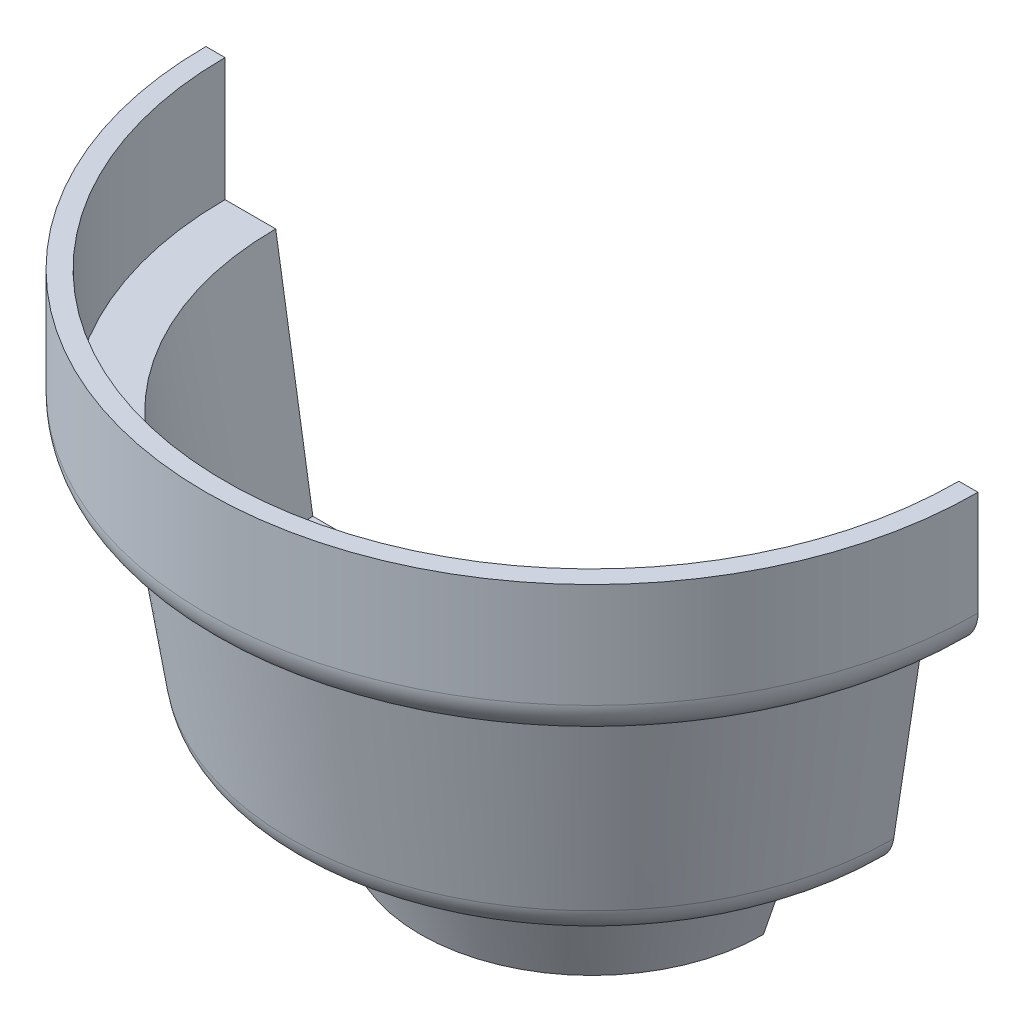
ISO-10303-21;
HEADER;
FILE_DESCRIPTION(('STEP AP214'),'2;1');
FILE_NAME('part.step','',(''),(''),'','','');
FILE_SCHEMA(('AUTOMOTIVE_DESIGN { 1 0 10303 214 1 1 1 1 }'));
ENDSEC;
DATA;
#1=APPLICATION_CONTEXT('core data for automotive mechanical design processes');
#2=APPLICATION_PROTOCOL_DEFINITION('international standard','automotive_design',2000,#1);
#3=PRODUCT_CONTEXT('',#1,'mechanical');
#4=PRODUCT('Part','Part','',(#3));
#5=PRODUCT_RELATED_PRODUCT_CATEGORY('part','',(#4));
#6=PRODUCT_DEFINITION_FORMATION('','',#4);
#7=PRODUCT_DEFINITION_CONTEXT('part definition',#1,'design');
#8=PRODUCT_DEFINITION('design','',#6,#7);
#9=PRODUCT_DEFINITION_SHAPE('','',#8);
#10=(LENGTH_UNIT() NAMED_UNIT(*) SI_UNIT(.MILLI.,.METRE.));
#11=(NAMED_UNIT(*) PLANE_ANGLE_UNIT() SI_UNIT($,.RADIAN.));
#12=(NAMED_UNIT(*) SI_UNIT($,.STERADIAN.) SOLID_ANGLE_UNIT());
#13=UNCERTAINTY_MEASURE_WITH_UNIT(LENGTH_MEASURE(1.E-05),#10,'distance_accuracy_value','');
#14=(GEOMETRIC_REPRESENTATION_CONTEXT(3) GLOBAL_UNCERTAINTY_ASSIGNED_CONTEXT((#13)) GLOBAL_UNIT_ASSIGNED_CONTEXT((#10,
#11,#12)) REPRESENTATION_CONTEXT('',''));
#15=CARTESIAN_POINT('',(0.,0.,0.));
#16=DIRECTION('',(0.,0.,1.));
#17=DIRECTION('',(1.,0.,0.));
#18=AXIS2_PLACEMENT_3D('',#15,#16,#17);
#19=CARTESIAN_POINT('',(321.047285868813,38.0058495677419,0.));
#20=DIRECTION('',(0.,-1.,0.));
#21=DIRECTION('',(0.,0.,-1.));
#22=AXIS2_PLACEMENT_3D('',#19,#20,#21);
#23=CYLINDRICAL_SURFACE('',#22,22.0628773907383);
#24=DIRECTION('',(0.,-1.,0.));
#25=VECTOR('',#24,1.);
#26=CARTESIAN_POINT('',(298.984408478074,66.0235079736991,0.));
#27=LINE('',#26,#25);
#28=CARTESIAN_POINT('',(298.984408478074,66.0235079736991,0.));
#29=VERTEX_POINT('',#28);
#30=CARTESIAN_POINT('',(298.984408478074,60.041083960857,0.));
#31=VERTEX_POINT('',#30);
#32=EDGE_CURVE('E169',#29,#31,#27,.T.);
#33=ORIENTED_EDGE('',*,*,#32,.T.);
#34=CARTESIAN_POINT('',(321.047285868813,60.041083960857,0.));
#35=DIRECTION('',(0.,1.,0.));
#36=DIRECTION('',(0.,0.,1.));
#37=AXIS2_PLACEMENT_3D('',#34,#35,#36);
#38=CIRCLE('',#37,22.0628773907383);
#39=CARTESIAN_POINT('',(343.110163259551,60.041083960857,-1.54064249381893E-13));
#40=VERTEX_POINT('',#39);
#41=EDGE_CURVE('E313',#31,#40,#38,.T.);
#42=ORIENTED_EDGE('',*,*,#41,.T.);
#43=DIRECTION('',(0.,-1.,0.));
#44=VECTOR('',#43,1.);
#45=CARTESIAN_POINT('',(343.110163259551,66.0235079736991,-1.54064249381893E-13));
#46=LINE('',#45,#44);
#47=CARTESIAN_POINT('',(343.110163259551,66.0235079736991,-1.54064249381893E-13));
#48=VERTEX_POINT('',#47);
#49=EDGE_CURVE('E223',#48,#40,#46,.T.);
#50=ORIENTED_EDGE('',*,*,#49,.F.);
#51=CARTESIAN_POINT('',(321.047285868813,66.0235079736991,0.));
#52=DIRECTION('',(0.,-1.,0.));
#53=DIRECTION('',(0.,0.,-1.));
#54=AXIS2_PLACEMENT_3D('',#51,#52,#53);
#55=CIRCLE('',#54,22.0628773907383);
#56=EDGE_CURVE('E274',#48,#29,#55,.T.);
#57=ORIENTED_EDGE('',*,*,#56,.T.);
#58=EDGE_LOOP('',(#33,#42,#50,#57));
#59=FACE_BOUND('',#58,.T.);
#60=ADVANCED_FACE('F45',(#59),#23,.T.);
#61=CARTESIAN_POINT('',(343.110163259551,58.041083960857,-1.54064249381893E-13));
#62=DIRECTION('',(0.,1.,0.));
#63=DIRECTION('',(0.,0.,1.));
#64=AXIS2_PLACEMENT_3D('',#61,#62,#63);
#65=PLANE('',#64);
#66=DIRECTION('',(-1.,0.,0.));
#67=VECTOR('',#66,1.);
#68=CARTESIAN_POINT('',(343.110163259551,58.041083960857,-1.54064249381893E-13));
#69=LINE('',#68,#67);
#70=CARTESIAN_POINT('',(341.110163259551,58.041083960857,-1.40098324026521E-13));
#71=VERTEX_POINT('',#70);
#72=CARTESIAN_POINT('',(340.075256902789,58.041083960857,-1.32871611562355E-13));
#73=VERTEX_POINT('',#72);
#74=EDGE_CURVE('E227',#71,#73,#69,.T.);
#75=ORIENTED_EDGE('',*,*,#74,.F.);
#76=CARTESIAN_POINT('',(321.047285868813,58.041083960857,0.));
#77=DIRECTION('',(0.,1.,0.));
#78=DIRECTION('',(0.,0.,1.));
#79=AXIS2_PLACEMENT_3D('',#76,#77,#78);
#80=CIRCLE('',#79,20.0628773907383);
#81=CARTESIAN_POINT('',(300.984408478074,58.041083960857,0.));
#82=VERTEX_POINT('',#81);
#83=EDGE_CURVE('E166',#71,#82,#80,.F.);
#84=ORIENTED_EDGE('',*,*,#83,.T.);
#85=DIRECTION('',(1.,0.,0.));
#86=VECTOR('',#85,1.);
#87=CARTESIAN_POINT('',(298.984408478074,58.041083960857,0.));
#88=LINE('',#87,#86);
#89=CARTESIAN_POINT('',(302.019314834836,58.041083960857,0.));
#90=VERTEX_POINT('',#89);
#91=EDGE_CURVE('E160',#82,#90,#88,.T.);
#92=ORIENTED_EDGE('',*,*,#91,.T.);
#93=CARTESIAN_POINT('',(321.047285868813,58.041083960857,0.));
#94=DIRECTION('',(0.,-1.,0.));
#95=DIRECTION('',(0.,0.,-1.));
#96=AXIS2_PLACEMENT_3D('',#93,#94,#95);
#97=CIRCLE('',#96,19.0279710339767);
#98=EDGE_CURVE('E164',#73,#90,#97,.T.);
#99=ORIENTED_EDGE('',*,*,#98,.F.);
#100=EDGE_LOOP('',(#75,#84,#92,#99));
#101=FACE_BOUND('',#100,.T.);
#102=ADVANCED_FACE('F163',(#101),#65,.F.);
#103=CARTESIAN_POINT('',(321.047285868813,58.041083960857,0.));
#104=DIRECTION('',(0.,1.,0.));
#105=DIRECTION('',(0.,0.,1.));
#106=AXIS2_PLACEMENT_3D('',#103,#104,#105);
#107=CONICAL_SURFACE('',#106,19.0279710339767,0.152761264242572);
#108=DIRECTION('',(0.15216781752453,-0.988354670808926,0.));
#109=VECTOR('',#108,1.);
#110=CARTESIAN_POINT('',(302.019314834836,58.041083960857,0.));
#111=LINE('',#110,#109);
#112=CARTESIAN_POINT('',(303.800598539088,46.4713572093391,0.));
#113=VERTEX_POINT('',#112);
#114=EDGE_CURVE('E168',#90,#113,#111,.T.);
#115=ORIENTED_EDGE('',*,*,#114,.T.);
#116=CARTESIAN_POINT('',(321.047285868813,46.4713572093391,0.));
#117=DIRECTION('',(0.,-1.,0.));
#118=DIRECTION('',(0.,0.,-1.));
#119=AXIS2_PLACEMENT_3D('',#116,#117,#118);
#120=CIRCLE('',#119,17.2466873297244);
#121=CARTESIAN_POINT('',(338.293973198537,46.4713572093391,-1.2043297393719E-13));
#122=VERTEX_POINT('',#121);
#123=EDGE_CURVE('E54',#113,#122,#120,.F.);
#124=ORIENTED_EDGE('',*,*,#123,.T.);
#125=DIRECTION('',(-0.15216781752453,-0.988354670808926,0.));
#126=VECTOR('',#125,1.);
#127=CARTESIAN_POINT('',(340.075256902789,58.041083960857,-1.32871611562355E-13));
#128=LINE('',#127,#126);
#129=EDGE_CURVE('E172',#73,#122,#128,.T.);
#130=ORIENTED_EDGE('',*,*,#129,.F.);
#131=ORIENTED_EDGE('',*,*,#98,.T.);
#132=EDGE_LOOP('',(#115,#124,#130,#131));
#133=FACE_BOUND('',#132,.T.);
#134=ADVANCED_FACE('F171',(#133),#107,.T.);
#135=CARTESIAN_POINT('',(338.03290745636,44.7756928443881,-1.18609961603147E-13));
#136=DIRECTION('',(0.,1.,0.));
#137=DIRECTION('',(0.,0.,1.));
#138=AXIS2_PLACEMENT_3D('',#135,#136,#137);
#139=PLANE('',#138);
#140=DIRECTION('',(-1.,0.,0.));
#141=VECTOR('',#140,1.);
#142=CARTESIAN_POINT('',(338.03290745636,44.7756928443881,-1.18609961603147E-13));
#143=LINE('',#142,#141);
#144=CARTESIAN_POINT('',(336.317263856919,44.7756928443881,-1.06629686380039E-13));
#145=VERTEX_POINT('',#144);
#146=CARTESIAN_POINT('',(333.161922659749,44.7756928443881,0.));
#147=VERTEX_POINT('',#146);
#148=EDGE_CURVE('E232',#145,#147,#143,.T.);
#149=ORIENTED_EDGE('',*,*,#148,.F.);
#150=CARTESIAN_POINT('',(321.047285868813,44.7756928443881,0.));
#151=DIRECTION('',(0.,1.,0.));
#152=DIRECTION('',(0.,0.,1.));
#153=AXIS2_PLACEMENT_3D('',#150,#151,#152);
#154=CIRCLE('',#153,15.2699779881065);
#155=CARTESIAN_POINT('',(305.777307880706,44.7756928443881,0.));
#156=VERTEX_POINT('',#155);
#157=EDGE_CURVE('E319',#145,#156,#154,.F.);
#158=ORIENTED_EDGE('',*,*,#157,.T.);
#159=DIRECTION('',(1.,0.,0.));
#160=VECTOR('',#159,1.);
#161=CARTESIAN_POINT('',(304.061664281265,44.7756928443881,0.));
#162=LINE('',#161,#160);
#163=CARTESIAN_POINT('',(308.932649077876,44.7756928443881,0.));
#164=VERTEX_POINT('',#163);
#165=EDGE_CURVE('E178',#156,#164,#162,.T.);
#166=ORIENTED_EDGE('',*,*,#165,.T.);
#167=CARTESIAN_POINT('',(321.047285868813,44.7756928443881,0.));
#168=DIRECTION('',(0.,-1.,0.));
#169=DIRECTION('',(0.,0.,-1.));
#170=AXIS2_PLACEMENT_3D('',#167,#168,#169);
#171=CIRCLE('',#170,12.1146367909363);
#172=EDGE_CURVE('E174',#147,#164,#171,.T.);
#173=ORIENTED_EDGE('',*,*,#172,.F.);
#174=EDGE_LOOP('',(#149,#158,#166,#173));
#175=FACE_BOUND('',#174,.T.);
#176=ADVANCED_FACE('F328',(#175),#139,.F.);
#177=CARTESIAN_POINT('',(321.047285868813,44.7756928443881,0.));
#178=DIRECTION('',(0.,1.,0.));
#179=DIRECTION('',(0.,0.,1.));
#180=AXIS2_PLACEMENT_3D('',#177,#178,#179);
#181=CONICAL_SURFACE('',#180,12.1146367909363,0.329049694840344);
#182=CARTESIAN_POINT('',(321.047285868813,38.0058495677419,0.));
#183=DIRECTION('',(0.,-1.,0.));
#184=DIRECTION('',(0.,0.,-1.));
#185=AXIS2_PLACEMENT_3D('',#182,#183,#184);
#186=CIRCLE('',#185,9.80298298915461);
#187=CARTESIAN_POINT('',(330.850268857967,38.0058495677419,0.));
#188=VERTEX_POINT('',#187);
#189=CARTESIAN_POINT('',(311.244302879658,38.0058495677419,0.));
#190=VERTEX_POINT('',#189);
#191=EDGE_CURVE('E302',#188,#190,#186,.T.);
#192=ORIENTED_EDGE('',*,*,#191,.F.);
#193=DIRECTION('',(-0.323143853291515,-0.946349856067993,0.));
#194=VECTOR('',#193,1.);
#195=CARTESIAN_POINT('',(333.161922659749,44.7756928443881,0.));
#196=LINE('',#195,#194);
#197=EDGE_CURVE('E235',#147,#188,#196,.T.);
#198=ORIENTED_EDGE('',*,*,#197,.F.);
#199=ORIENTED_EDGE('',*,*,#172,.T.);
#200=DIRECTION('',(0.323143853291515,-0.946349856067993,0.));
#201=VECTOR('',#200,1.);
#202=CARTESIAN_POINT('',(308.932649077876,44.7756928443881,0.));
#203=LINE('',#202,#201);
#204=EDGE_CURVE('E181',#164,#190,#203,.T.);
#205=ORIENTED_EDGE('',*,*,#204,.T.);
#206=EDGE_LOOP('',(#192,#198,#199,#205));
#207=FACE_BOUND('',#206,.T.);
#208=ADVANCED_FACE('F336',(#207),#181,.T.);
#209=CARTESIAN_POINT('',(330.850268857967,38.0058495677419,0.));
#210=DIRECTION('',(0.,1.,0.));
#211=DIRECTION('',(0.,0.,1.));
#212=AXIS2_PLACEMENT_3D('',#209,#210,#211);
#213=PLANE('',#212);
#214=CARTESIAN_POINT('',(321.047285868813,38.0058495677419,0.));
#215=DIRECTION('',(0.,-1.,0.));
#216=DIRECTION('',(0.,0.,-1.));
#217=AXIS2_PLACEMENT_3D('',#214,#215,#216);
#218=CIRCLE('',#217,7.06097523429028);
#219=CARTESIAN_POINT('',(328.108261103103,38.0058495677419,0.));
#220=VERTEX_POINT('',#219);
#221=CARTESIAN_POINT('',(313.986310634522,38.0058495677419,0.));
#222=VERTEX_POINT('',#221);
#223=EDGE_CURVE('E299',#220,#222,#218,.T.);
#224=ORIENTED_EDGE('',*,*,#223,.F.);
#225=DIRECTION('',(-1.,0.,0.));
#226=VECTOR('',#225,1.);
#227=CARTESIAN_POINT('',(330.850268857967,38.0058495677419,0.));
#228=LINE('',#227,#226);
#229=EDGE_CURVE('E239',#188,#220,#228,.T.);
#230=ORIENTED_EDGE('',*,*,#229,.F.);
#231=ORIENTED_EDGE('',*,*,#191,.T.);
#232=DIRECTION('',(1.,0.,0.));
#233=VECTOR('',#232,1.);
#234=CARTESIAN_POINT('',(311.244302879658,38.0058495677419,0.));
#235=LINE('',#234,#233);
#236=EDGE_CURVE('E188',#190,#222,#235,.T.);
#237=ORIENTED_EDGE('',*,*,#236,.T.);
#238=EDGE_LOOP('',(#224,#230,#231,#237));
#239=FACE_BOUND('',#238,.T.);
#240=ADVANCED_FACE('F343',(#239),#213,.F.);
#241=CARTESIAN_POINT('',(321.047285868813,38.0058495677419,0.));
#242=DIRECTION('',(0.,-1.,0.));
#243=DIRECTION('',(0.,0.,-1.));
#244=AXIS2_PLACEMENT_3D('',#241,#242,#243);
#245=CYLINDRICAL_SURFACE('',#244,7.06097523429028);
#246=CARTESIAN_POINT('',(321.047285868813,38.9746322381523,0.));
#247=DIRECTION('',(0.,-1.,0.));
#248=DIRECTION('',(0.,0.,-1.));
#249=AXIS2_PLACEMENT_3D('',#246,#247,#248);
#250=CIRCLE('',#249,7.06097523429028);
#251=CARTESIAN_POINT('',(328.108261103103,38.9746322381523,0.));
#252=VERTEX_POINT('',#251);
#253=CARTESIAN_POINT('',(313.986310634522,38.9746322381523,0.));
#254=VERTEX_POINT('',#253);
#255=EDGE_CURVE('E296',#252,#254,#250,.T.);
#256=ORIENTED_EDGE('',*,*,#255,.F.);
#257=DIRECTION('',(0.,1.,0.));
#258=VECTOR('',#257,1.);
#259=CARTESIAN_POINT('',(328.108261103103,38.9746322381523,0.));
#260=LINE('',#259,#258);
#261=EDGE_CURVE('E243',#220,#252,#260,.T.);
#262=ORIENTED_EDGE('',*,*,#261,.F.);
#263=ORIENTED_EDGE('',*,*,#223,.T.);
#264=DIRECTION('',(0.,1.,0.));
#265=VECTOR('',#264,1.);
#266=CARTESIAN_POINT('',(313.986310634522,38.9746322381523,0.));
#267=LINE('',#266,#265);
#268=EDGE_CURVE('E192',#222,#254,#267,.T.);
#269=ORIENTED_EDGE('',*,*,#268,.T.);
#270=EDGE_LOOP('',(#256,#262,#263,#269));
#271=FACE_BOUND('',#270,.T.);
#272=ADVANCED_FACE('F345',(#271),#245,.F.);
#273=CARTESIAN_POINT('',(330.085804472857,38.9746322381523,0.));
#274=DIRECTION('',(0.,-1.,0.));
#275=DIRECTION('',(0.,0.,-1.));
#276=AXIS2_PLACEMENT_3D('',#273,#274,#275);
#277=PLANE('',#276);
#278=CARTESIAN_POINT('',(321.047285868813,38.9746322381523,0.));
#279=DIRECTION('',(0.,-1.,0.));
#280=DIRECTION('',(0.,0.,-1.));
#281=AXIS2_PLACEMENT_3D('',#278,#279,#280);
#282=CIRCLE('',#281,9.03851860404403);
#283=CARTESIAN_POINT('',(330.085804472857,38.9746322381523,0.));
#284=VERTEX_POINT('',#283);
#285=CARTESIAN_POINT('',(312.008767264769,38.9746322381523,0.));
#286=VERTEX_POINT('',#285);
#287=EDGE_CURVE('E293',#284,#286,#282,.T.);
#288=ORIENTED_EDGE('',*,*,#287,.F.);
#289=DIRECTION('',(1.,0.,0.));
#290=VECTOR('',#289,1.);
#291=CARTESIAN_POINT('',(330.085804472857,38.9746322381523,0.));
#292=LINE('',#291,#290);
#293=EDGE_CURVE('E247',#252,#284,#292,.T.);
#294=ORIENTED_EDGE('',*,*,#293,.F.);
#295=ORIENTED_EDGE('',*,*,#255,.T.);
#296=DIRECTION('',(-1.,0.,0.));
#297=VECTOR('',#296,1.);
#298=CARTESIAN_POINT('',(312.008767264769,38.9746322381523,0.));
#299=LINE('',#298,#297);
#300=EDGE_CURVE('E196',#254,#286,#299,.T.);
#301=ORIENTED_EDGE('',*,*,#300,.T.);
#302=EDGE_LOOP('',(#288,#294,#295,#301));
#303=FACE_BOUND('',#302,.T.);
#304=ADVANCED_FACE('F350',(#303),#277,.F.);
#305=CARTESIAN_POINT('',(321.047285868813,38.9746322381523,0.));
#306=DIRECTION('',(0.,1.,0.));
#307=DIRECTION('',(0.,0.,1.));
#308=AXIS2_PLACEMENT_3D('',#305,#306,#307);
#309=CONICAL_SURFACE('',#308,9.03851860404403,0.297451540659456);
#310=CARTESIAN_POINT('',(321.047285868813,45.8292245133357,0.));
#311=DIRECTION('',(0.,-1.,0.));
#312=DIRECTION('',(0.,0.,-1.));
#313=AXIS2_PLACEMENT_3D('',#310,#311,#312);
#314=CIRCLE('',#313,11.1397673007583);
#315=CARTESIAN_POINT('',(332.187053169571,45.8292245133357,0.));
#316=VERTEX_POINT('',#315);
#317=CARTESIAN_POINT('',(309.907518568054,45.8292245133357,0.));
#318=VERTEX_POINT('',#317);
#319=EDGE_CURVE('E290',#316,#318,#314,.T.);
#320=ORIENTED_EDGE('',*,*,#319,.F.);
#321=DIRECTION('',(0.293084613448715,0.95608650725738,0.));
#322=VECTOR('',#321,1.);
#323=CARTESIAN_POINT('',(332.187053169571,45.8292245133357,0.));
#324=LINE('',#323,#322);
#325=EDGE_CURVE('E251',#284,#316,#324,.T.);
#326=ORIENTED_EDGE('',*,*,#325,.F.);
#327=ORIENTED_EDGE('',*,*,#287,.T.);
#328=DIRECTION('',(-0.293084613448715,0.95608650725738,0.));
#329=VECTOR('',#328,1.);
#330=CARTESIAN_POINT('',(309.907518568054,45.8292245133357,0.));
#331=LINE('',#330,#329);
#332=EDGE_CURVE('E200',#286,#318,#331,.T.);
#333=ORIENTED_EDGE('',*,*,#332,.T.);
#334=EDGE_LOOP('',(#320,#326,#327,#333));
#335=FACE_BOUND('',#334,.T.);
#336=ADVANCED_FACE('F353',(#335),#309,.F.);
#337=CARTESIAN_POINT('',(336.999184886418,45.8292245133357,-1.11391515478157E-13));
#338=DIRECTION('',(0.,-1.,0.));
#339=DIRECTION('',(0.,0.,-1.));
#340=AXIS2_PLACEMENT_3D('',#337,#338,#339);
#341=PLANE('',#340);
#342=CARTESIAN_POINT('',(321.047285868813,45.8292245133357,0.));
#343=DIRECTION('',(0.,-1.,0.));
#344=DIRECTION('',(0.,0.,-1.));
#345=AXIS2_PLACEMENT_3D('',#342,#343,#344);
#346=CIRCLE('',#345,15.9518990176051);
#347=CARTESIAN_POINT('',(336.999184886418,45.8292245133357,-1.11391515478157E-13));
#348=VERTEX_POINT('',#347);
#349=CARTESIAN_POINT('',(305.095386851207,45.8292245133357,0.));
#350=VERTEX_POINT('',#349);
#351=EDGE_CURVE('E286',#348,#350,#346,.T.);
#352=ORIENTED_EDGE('',*,*,#351,.F.);
#353=DIRECTION('',(1.,0.,0.));
#354=VECTOR('',#353,1.);
#355=CARTESIAN_POINT('',(333.161922659749,45.8292245133357,0.));
#356=LINE('',#355,#354);
#357=EDGE_CURVE('E255',#316,#348,#356,.T.);
#358=ORIENTED_EDGE('',*,*,#357,.F.);
#359=ORIENTED_EDGE('',*,*,#319,.T.);
#360=DIRECTION('',(-1.,0.,0.));
#361=VECTOR('',#360,1.);
#362=CARTESIAN_POINT('',(308.932649077876,45.8292245133357,0.));
#363=LINE('',#362,#361);
#364=EDGE_CURVE('E204',#318,#350,#363,.T.);
#365=ORIENTED_EDGE('',*,*,#364,.T.);
#366=EDGE_LOOP('',(#352,#358,#359,#365));
#367=FACE_BOUND('',#366,.T.);
#368=ADVANCED_FACE('F358',(#367),#341,.F.);
#369=CARTESIAN_POINT('',(321.047285868813,45.8292245133357,0.));
#370=DIRECTION('',(0.,1.,0.));
#371=DIRECTION('',(0.,0.,1.));
#372=AXIS2_PLACEMENT_3D('',#369,#370,#371);
#373=CONICAL_SURFACE('',#372,15.9518990176051,0.159807644731626);
#374=CARTESIAN_POINT('',(321.047285868813,58.990397452456,0.));
#375=DIRECTION('',(0.,-1.,0.));
#376=DIRECTION('',(0.,0.,-1.));
#377=AXIS2_PLACEMENT_3D('',#374,#375,#376);
#378=CIRCLE('',#377,18.0732445369688);
#379=CARTESIAN_POINT('',(339.120530405781,58.990397452456,-1.2620479206635E-13));
#380=VERTEX_POINT('',#379);
#381=CARTESIAN_POINT('',(302.974041331844,58.990397452456,0.));
#382=VERTEX_POINT('',#381);
#383=EDGE_CURVE('E283',#380,#382,#378,.T.);
#384=ORIENTED_EDGE('',*,*,#383,.F.);
#385=DIRECTION('',(0.159128305298946,0.987257910807852,0.));
#386=VECTOR('',#385,1.);
#387=CARTESIAN_POINT('',(339.120530405781,58.990397452456,-1.2620479206635E-13));
#388=LINE('',#387,#386);
#389=EDGE_CURVE('E258',#348,#380,#388,.T.);
#390=ORIENTED_EDGE('',*,*,#389,.F.);
#391=ORIENTED_EDGE('',*,*,#351,.T.);
#392=DIRECTION('',(-0.159128305298946,0.987257910807852,0.));
#393=VECTOR('',#392,1.);
#394=CARTESIAN_POINT('',(302.974041331844,58.990397452456,0.));
#395=LINE('',#394,#393);
#396=EDGE_CURVE('E207',#350,#382,#395,.T.);
#397=ORIENTED_EDGE('',*,*,#396,.T.);
#398=EDGE_LOOP('',(#384,#390,#391,#397));
#399=FACE_BOUND('',#398,.T.);
#400=ADVANCED_FACE('F362',(#399),#373,.F.);
#401=CARTESIAN_POINT('',(342.016517090999,58.990397452456,-1.46427359004302E-13));
#402=DIRECTION('',(0.,-1.,0.));
#403=DIRECTION('',(0.,0.,-1.));
#404=AXIS2_PLACEMENT_3D('',#401,#402,#403);
#405=PLANE('',#404);
#406=CARTESIAN_POINT('',(321.047285868813,58.990397452456,0.));
#407=DIRECTION('',(0.,-1.,0.));
#408=DIRECTION('',(0.,0.,-1.));
#409=AXIS2_PLACEMENT_3D('',#406,#407,#408);
#410=CIRCLE('',#409,20.9692312221865);
#411=CARTESIAN_POINT('',(342.016517090999,58.990397452456,-1.46427359004302E-13));
#412=VERTEX_POINT('',#411);
#413=CARTESIAN_POINT('',(300.078054646626,58.990397452456,0.));
#414=VERTEX_POINT('',#413);
#415=EDGE_CURVE('E280',#412,#414,#410,.T.);
#416=ORIENTED_EDGE('',*,*,#415,.F.);
#417=DIRECTION('',(1.,0.,0.));
#418=VECTOR('',#417,1.);
#419=CARTESIAN_POINT('',(342.016517090999,58.990397452456,-1.46427359004302E-13));
#420=LINE('',#419,#418);
#421=EDGE_CURVE('E262',#380,#412,#420,.T.);
#422=ORIENTED_EDGE('',*,*,#421,.F.);
#423=ORIENTED_EDGE('',*,*,#383,.T.);
#424=DIRECTION('',(-1.,0.,0.));
#425=VECTOR('',#424,1.);
#426=CARTESIAN_POINT('',(300.078054646626,58.990397452456,0.));
#427=LINE('',#426,#425);
#428=EDGE_CURVE('E211',#382,#414,#427,.T.);
#429=ORIENTED_EDGE('',*,*,#428,.T.);
#430=EDGE_LOOP('',(#416,#422,#423,#429));
#431=FACE_BOUND('',#430,.T.);
#432=ADVANCED_FACE('F366',(#431),#405,.F.);
#433=CARTESIAN_POINT('',(321.047285868813,38.0058495677419,0.));
#434=DIRECTION('',(0.,-1.,0.));
#435=DIRECTION('',(0.,0.,-1.));
#436=AXIS2_PLACEMENT_3D('',#433,#434,#435);
#437=CYLINDRICAL_SURFACE('',#436,20.9692312221865);
#438=CARTESIAN_POINT('',(321.047285868813,66.0235079736991,0.));
#439=DIRECTION('',(0.,-1.,0.));
#440=DIRECTION('',(0.,0.,-1.));
#441=AXIS2_PLACEMENT_3D('',#438,#439,#440);
#442=CIRCLE('',#441,20.9692312221865);
#443=CARTESIAN_POINT('',(342.016517090999,66.0235079736991,-1.46427359004302E-13));
#444=VERTEX_POINT('',#443);
#445=CARTESIAN_POINT('',(300.078054646626,66.0235079736991,0.));
#446=VERTEX_POINT('',#445);
#447=EDGE_CURVE('E277',#444,#446,#442,.T.);
#448=ORIENTED_EDGE('',*,*,#447,.F.);
#449=DIRECTION('',(0.,1.,0.));
#450=VECTOR('',#449,1.);
#451=CARTESIAN_POINT('',(342.016517090999,66.0235079736991,-1.46427359004302E-13));
#452=LINE('',#451,#450);
#453=EDGE_CURVE('E266',#412,#444,#452,.T.);
#454=ORIENTED_EDGE('',*,*,#453,.F.);
#455=ORIENTED_EDGE('',*,*,#415,.T.);
#456=DIRECTION('',(0.,1.,0.));
#457=VECTOR('',#456,1.);
#458=CARTESIAN_POINT('',(300.078054646626,66.0235079736991,0.));
#459=LINE('',#458,#457);
#460=EDGE_CURVE('E215',#414,#446,#459,.T.);
#461=ORIENTED_EDGE('',*,*,#460,.T.);
#462=EDGE_LOOP('',(#448,#454,#455,#461));
#463=FACE_BOUND('',#462,.T.);
#464=ADVANCED_FACE('F370',(#463),#437,.F.);
#465=CARTESIAN_POINT('',(342.016517090999,66.0235079736991,-1.46427359004302E-13));
#466=DIRECTION('',(0.,-1.,0.));
#467=DIRECTION('',(0.,0.,-1.));
#468=AXIS2_PLACEMENT_3D('',#465,#466,#467);
#469=PLANE('',#468);
#470=DIRECTION('',(1.,0.,0.));
#471=VECTOR('',#470,1.);
#472=CARTESIAN_POINT('',(342.016517090999,66.0235079736991,-1.46427359004302E-13));
#473=LINE('',#472,#471);
#474=EDGE_CURVE('E270',#444,#48,#473,.T.);
#475=ORIENTED_EDGE('',*,*,#474,.F.);
#476=ORIENTED_EDGE('',*,*,#447,.T.);
#477=DIRECTION('',(-1.,0.,0.));
#478=VECTOR('',#477,1.);
#479=CARTESIAN_POINT('',(300.078054646626,66.0235079736991,0.));
#480=LINE('',#479,#478);
#481=EDGE_CURVE('E219',#446,#29,#480,.T.);
#482=ORIENTED_EDGE('',*,*,#481,.T.);
#483=ORIENTED_EDGE('',*,*,#56,.F.);
#484=EDGE_LOOP('',(#475,#476,#482,#483));
#485=FACE_BOUND('',#484,.T.);
#486=ADVANCED_FACE('F374',(#485),#469,.F.);
#487=CARTESIAN_POINT('',(642.094571737625,0.,-2.24186121499439E-12));
#488=DIRECTION('',(0.,0.,-1.));
#489=DIRECTION('',(-1.,0.,0.));
#490=AXIS2_PLACEMENT_3D('',#487,#488,#489);
#491=PLANE('',#490);
#492=ORIENTED_EDGE('',*,*,#129,.T.);
#493=CARTESIAN_POINT('',(336.317263856919,46.7756928443881,-1.06629686380039E-13));
#494=DIRECTION('',(0.,0.,-1.));
#495=DIRECTION('',(-1.,0.,0.));
#496=AXIS2_PLACEMENT_3D('',#493,#494,#495);
#497=CIRCLE('',#496,2.);
#498=EDGE_CURVE('E11',#122,#145,#497,.T.);
#499=ORIENTED_EDGE('',*,*,#498,.T.);
#500=ORIENTED_EDGE('',*,*,#148,.T.);
#501=ORIENTED_EDGE('',*,*,#197,.T.);
#502=ORIENTED_EDGE('',*,*,#229,.T.);
#503=ORIENTED_EDGE('',*,*,#261,.T.);
#504=ORIENTED_EDGE('',*,*,#293,.T.);
#505=ORIENTED_EDGE('',*,*,#325,.T.);
#506=ORIENTED_EDGE('',*,*,#357,.T.);
#507=ORIENTED_EDGE('',*,*,#389,.T.);
#508=ORIENTED_EDGE('',*,*,#421,.T.);
#509=ORIENTED_EDGE('',*,*,#453,.T.);
#510=ORIENTED_EDGE('',*,*,#474,.T.);
#511=ORIENTED_EDGE('',*,*,#49,.T.);
#512=CARTESIAN_POINT('',(341.110163259551,60.041083960857,-1.40098324026521E-13));
#513=DIRECTION('',(0.,0.,-1.));
#514=DIRECTION('',(-1.,0.,0.));
#515=AXIS2_PLACEMENT_3D('',#512,#513,#514);
#516=CIRCLE('',#515,2.);
#517=EDGE_CURVE('E316',#40,#71,#516,.T.);
#518=ORIENTED_EDGE('',*,*,#517,.T.);
#519=ORIENTED_EDGE('',*,*,#74,.T.);
#520=EDGE_LOOP('',(#492,#499,#500,#501,#502,#503,#504,#505,#506,#507,#508,#509,#510,#511,#518,#519));
#521=FACE_BOUND('',#520,.T.);
#522=ADVANCED_FACE('F340',(#521),#491,.T.);
#523=CARTESIAN_POINT('',(0.,0.,0.));
#524=DIRECTION('',(0.,0.,1.));
#525=DIRECTION('',(1.,0.,0.));
#526=AXIS2_PLACEMENT_3D('',#523,#524,#525);
#527=PLANE('',#526);
#528=ORIENTED_EDGE('',*,*,#165,.F.);
#529=CARTESIAN_POINT('',(305.777307880706,46.7756928443881,0.));
#530=DIRECTION('',(0.,0.,1.));
#531=DIRECTION('',(1.,0.,0.));
#532=AXIS2_PLACEMENT_3D('',#529,#530,#531);
#533=CIRCLE('',#532,2.);
#534=EDGE_CURVE('E68',#156,#113,#533,.F.);
#535=ORIENTED_EDGE('',*,*,#534,.T.);
#536=ORIENTED_EDGE('',*,*,#114,.F.);
#537=ORIENTED_EDGE('',*,*,#91,.F.);
#538=CARTESIAN_POINT('',(300.984408478074,60.041083960857,0.));
#539=DIRECTION('',(0.,0.,1.));
#540=DIRECTION('',(1.,0.,0.));
#541=AXIS2_PLACEMENT_3D('',#538,#539,#540);
#542=CIRCLE('',#541,2.);
#543=EDGE_CURVE('E310',#82,#31,#542,.F.);
#544=ORIENTED_EDGE('',*,*,#543,.T.);
#545=ORIENTED_EDGE('',*,*,#32,.F.);
#546=ORIENTED_EDGE('',*,*,#481,.F.);
#547=ORIENTED_EDGE('',*,*,#460,.F.);
#548=ORIENTED_EDGE('',*,*,#428,.F.);
#549=ORIENTED_EDGE('',*,*,#396,.F.);
#550=ORIENTED_EDGE('',*,*,#364,.F.);
#551=ORIENTED_EDGE('',*,*,#332,.F.);
#552=ORIENTED_EDGE('',*,*,#300,.F.);
#553=ORIENTED_EDGE('',*,*,#268,.F.);
#554=ORIENTED_EDGE('',*,*,#236,.F.);
#555=ORIENTED_EDGE('',*,*,#204,.F.);
#556=EDGE_LOOP('',(#528,#535,#536,#537,#544,#545,#546,#547,#548,#549,#550,#551,#552,#553,#554,#555));
#557=FACE_BOUND('',#556,.T.);
#558=ADVANCED_FACE('F176',(#557),#527,.F.);
#559=CARTESIAN_POINT('',(321.047285868813,60.041083960857,0.));
#560=DIRECTION('',(0.,1.,0.));
#561=DIRECTION('',(0.,0.,1.));
#562=AXIS2_PLACEMENT_3D('',#559,#560,#561);
#563=TOROIDAL_SURFACE('',#562,20.0628773907383,2.);
#564=ORIENTED_EDGE('',*,*,#517,.F.);
#565=ORIENTED_EDGE('',*,*,#41,.F.);
#566=ORIENTED_EDGE('',*,*,#543,.F.);
#567=ORIENTED_EDGE('',*,*,#83,.F.);
#568=EDGE_LOOP('',(#564,#565,#566,#567));
#569=FACE_BOUND('',#568,.T.);
#570=ADVANCED_FACE('F382',(#569),#563,.T.);
#571=CARTESIAN_POINT('',(321.047285868813,46.7756928443881,0.));
#572=DIRECTION('',(0.,1.,0.));
#573=DIRECTION('',(0.,0.,1.));
#574=AXIS2_PLACEMENT_3D('',#571,#572,#573);
#575=TOROIDAL_SURFACE('',#574,15.2699779881065,2.);
#576=ORIENTED_EDGE('',*,*,#498,.F.);
#577=ORIENTED_EDGE('',*,*,#123,.F.);
#578=ORIENTED_EDGE('',*,*,#534,.F.);
#579=ORIENTED_EDGE('',*,*,#157,.F.);
#580=EDGE_LOOP('',(#576,#577,#578,#579));
#581=FACE_BOUND('',#580,.T.);
#582=ADVANCED_FACE('F47',(#581),#575,.T.);
#583=CLOSED_SHELL('',(#60,#102,#134,#176,#208,#240,#272,#304,#336,#368,#400,#432,#464,#486,#522,
#558,#570,#582));
#584=MANIFOLD_SOLID_BREP('B2',#583);
#585=ADVANCED_BREP_SHAPE_REPRESENTATION('',(#18,#584),#14);
#586=SHAPE_DEFINITION_REPRESENTATION(#9,#585);
ENDSEC;
END-ISO-10303-21;
